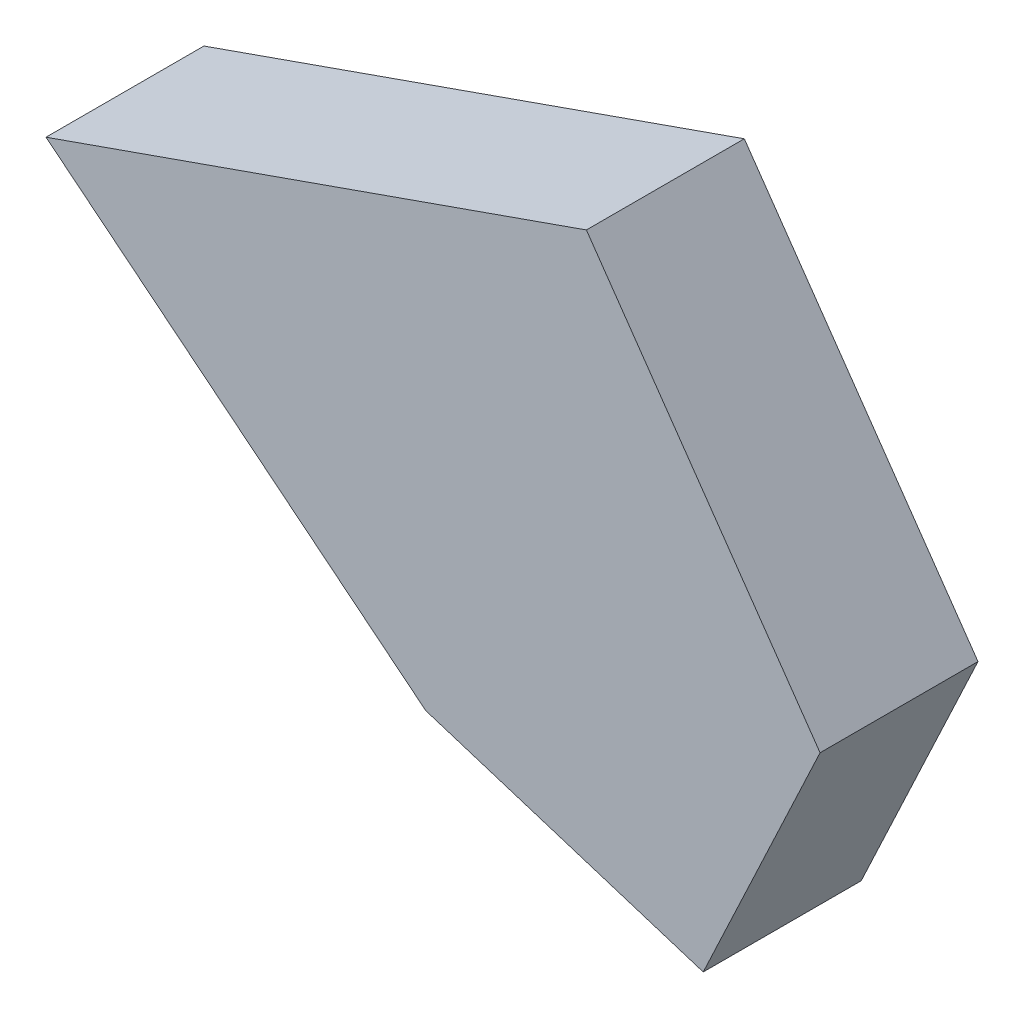
ISO-10303-21;
HEADER;
FILE_DESCRIPTION(('STEP AP214'),'2;1');
FILE_NAME('part.step','',(''),(''),'','','');
FILE_SCHEMA(('AUTOMOTIVE_DESIGN { 1 0 10303 214 1 1 1 1 }'));
ENDSEC;
DATA;
#1=APPLICATION_CONTEXT('core data for automotive mechanical design processes');
#2=APPLICATION_PROTOCOL_DEFINITION('international standard','automotive_design',2000,#1);
#3=PRODUCT_CONTEXT('',#1,'mechanical');
#4=PRODUCT('Part','Part','',(#3));
#5=PRODUCT_RELATED_PRODUCT_CATEGORY('part','',(#4));
#6=PRODUCT_DEFINITION_FORMATION('','',#4);
#7=PRODUCT_DEFINITION_CONTEXT('part definition',#1,'design');
#8=PRODUCT_DEFINITION('design','',#6,#7);
#9=PRODUCT_DEFINITION_SHAPE('','',#8);
#10=(LENGTH_UNIT() NAMED_UNIT(*) SI_UNIT(.MILLI.,.METRE.));
#11=(NAMED_UNIT(*) PLANE_ANGLE_UNIT() SI_UNIT($,.RADIAN.));
#12=(NAMED_UNIT(*) SI_UNIT($,.STERADIAN.) SOLID_ANGLE_UNIT());
#13=UNCERTAINTY_MEASURE_WITH_UNIT(LENGTH_MEASURE(1.E-05),#10,'distance_accuracy_value','');
#14=(GEOMETRIC_REPRESENTATION_CONTEXT(3) GLOBAL_UNCERTAINTY_ASSIGNED_CONTEXT((#13)) GLOBAL_UNIT_ASSIGNED_CONTEXT((#10,
#11,#12)) REPRESENTATION_CONTEXT('',''));
#15=CARTESIAN_POINT('',(0.,0.,0.));
#16=DIRECTION('',(0.,0.,1.));
#17=DIRECTION('',(1.,0.,0.));
#18=AXIS2_PLACEMENT_3D('',#15,#16,#17);
#19=CARTESIAN_POINT('',(0.,-3.,0.));
#20=DIRECTION('',(0.,0.,-1.));
#21=DIRECTION('',(1.,0.,0.));
#22=AXIS2_PLACEMENT_3D('',#19,#20,#21);
#23=PLANE('',#22);
#24=DIRECTION('',(0.777941180203722,-0.628337107087621,0.));
#25=VECTOR('',#24,1.);
#26=CARTESIAN_POINT('',(-26.,18.,0.));
#27=LINE('',#26,#25);
#28=CARTESIAN_POINT('',(-26.,18.,0.));
#29=VERTEX_POINT('',#28);
#30=CARTESIAN_POINT('',(0.,-3.,0.));
#31=VERTEX_POINT('',#30);
#32=EDGE_CURVE('E55',#29,#31,#27,.T.);
#33=ORIENTED_EDGE('',*,*,#32,.F.);
#34=DIRECTION('',(-0.943460139651132,-0.33148599501256,0.));
#35=VECTOR('',#34,1.);
#36=CARTESIAN_POINT('',(11.,31.,0.));
#37=LINE('',#36,#35);
#38=CARTESIAN_POINT('',(11.,31.,0.));
#39=VERTEX_POINT('',#38);
#40=EDGE_CURVE('E54',#39,#29,#37,.T.);
#41=ORIENTED_EDGE('',*,*,#40,.F.);
#42=DIRECTION('',(-0.5710644881986,0.820905201785487,0.));
#43=VECTOR('',#42,1.);
#44=CARTESIAN_POINT('',(27.,8.,0.));
#45=LINE('',#44,#43);
#46=CARTESIAN_POINT('',(27.,8.,0.));
#47=VERTEX_POINT('',#46);
#48=EDGE_CURVE('E53',#47,#39,#45,.T.);
#49=ORIENTED_EDGE('',*,*,#48,.F.);
#50=DIRECTION('',(0.42579703632988,0.904818702200994,0.));
#51=VECTOR('',#50,1.);
#52=CARTESIAN_POINT('',(19.,-9.,0.));
#53=LINE('',#52,#51);
#54=CARTESIAN_POINT('',(19.,-9.,0.));
#55=VERTEX_POINT('',#54);
#56=EDGE_CURVE('E52',#55,#47,#53,.T.);
#57=ORIENTED_EDGE('',*,*,#56,.F.);
#58=DIRECTION('',(0.953582665134142,-0.301131367937097,0.));
#59=VECTOR('',#58,1.);
#60=CARTESIAN_POINT('',(0.,-3.,0.));
#61=LINE('',#60,#59);
#62=EDGE_CURVE('E51',#31,#55,#61,.T.);
#63=ORIENTED_EDGE('',*,*,#62,.F.);
#64=EDGE_LOOP('',(#33,#41,#49,#57,#63));
#65=FACE_BOUND('',#64,.T.);
#66=ADVANCED_FACE('F7',(#65),#23,.T.);
#67=CARTESIAN_POINT('',(0.,-3.,10.813));
#68=DIRECTION('',(0.,0.,1.));
#69=DIRECTION('',(1.,0.,0.));
#70=AXIS2_PLACEMENT_3D('',#67,#68,#69);
#71=PLANE('',#70);
#72=DIRECTION('',(0.953582665134142,-0.301131367937097,0.));
#73=VECTOR('',#72,1.);
#74=CARTESIAN_POINT('',(0.,-3.,10.813));
#75=LINE('',#74,#73);
#76=CARTESIAN_POINT('',(0.,-3.,10.813));
#77=VERTEX_POINT('',#76);
#78=CARTESIAN_POINT('',(19.,-9.,10.813));
#79=VERTEX_POINT('',#78);
#80=EDGE_CURVE('E56',#77,#79,#75,.T.);
#81=ORIENTED_EDGE('',*,*,#80,.T.);
#82=DIRECTION('',(0.42579703632988,0.904818702200994,0.));
#83=VECTOR('',#82,1.);
#84=CARTESIAN_POINT('',(19.,-9.,10.813));
#85=LINE('',#84,#83);
#86=CARTESIAN_POINT('',(27.,8.,10.813));
#87=VERTEX_POINT('',#86);
#88=EDGE_CURVE('E57',#79,#87,#85,.T.);
#89=ORIENTED_EDGE('',*,*,#88,.T.);
#90=DIRECTION('',(-0.5710644881986,0.820905201785487,0.));
#91=VECTOR('',#90,1.);
#92=CARTESIAN_POINT('',(27.,8.,10.813));
#93=LINE('',#92,#91);
#94=CARTESIAN_POINT('',(11.,31.,10.813));
#95=VERTEX_POINT('',#94);
#96=EDGE_CURVE('E58',#87,#95,#93,.T.);
#97=ORIENTED_EDGE('',*,*,#96,.T.);
#98=DIRECTION('',(-0.943460139651132,-0.33148599501256,0.));
#99=VECTOR('',#98,1.);
#100=CARTESIAN_POINT('',(11.,31.,10.813));
#101=LINE('',#100,#99);
#102=CARTESIAN_POINT('',(-26.,18.,10.813));
#103=VERTEX_POINT('',#102);
#104=EDGE_CURVE('E59',#95,#103,#101,.T.);
#105=ORIENTED_EDGE('',*,*,#104,.T.);
#106=DIRECTION('',(0.777941180203722,-0.628337107087621,0.));
#107=VECTOR('',#106,1.);
#108=CARTESIAN_POINT('',(-26.,18.,10.813));
#109=LINE('',#108,#107);
#110=EDGE_CURVE('E60',#103,#77,#109,.T.);
#111=ORIENTED_EDGE('',*,*,#110,.T.);
#112=EDGE_LOOP('',(#81,#89,#97,#105,#111));
#113=FACE_BOUND('',#112,.T.);
#114=ADVANCED_FACE('F14',(#113),#71,.T.);
#115=CARTESIAN_POINT('',(0.,-3.,0.));
#116=DIRECTION('',(-0.301131367937097,-0.953582665134142,0.));
#117=DIRECTION('',(0.953582665134142,-0.301131367937097,0.));
#118=AXIS2_PLACEMENT_3D('',#115,#116,#117);
#119=PLANE('',#118);
#120=ORIENTED_EDGE('',*,*,#62,.T.);
#121=DIRECTION('',(0.,0.,1.));
#122=VECTOR('',#121,1.);
#123=CARTESIAN_POINT('',(19.,-9.,0.));
#124=LINE('',#123,#122);
#125=EDGE_CURVE('E62',#55,#79,#124,.T.);
#126=ORIENTED_EDGE('',*,*,#125,.T.);
#127=ORIENTED_EDGE('',*,*,#80,.F.);
#128=DIRECTION('',(0.,0.,1.));
#129=VECTOR('',#128,1.);
#130=CARTESIAN_POINT('',(0.,-3.,0.));
#131=LINE('',#130,#129);
#132=EDGE_CURVE('E61',#31,#77,#131,.T.);
#133=ORIENTED_EDGE('',*,*,#132,.F.);
#134=EDGE_LOOP('',(#120,#126,#127,#133));
#135=FACE_BOUND('',#134,.T.);
#136=ADVANCED_FACE('F21',(#135),#119,.T.);
#137=CARTESIAN_POINT('',(19.,-9.,0.));
#138=DIRECTION('',(0.904818702200994,-0.42579703632988,0.));
#139=DIRECTION('',(0.42579703632988,0.904818702200994,0.));
#140=AXIS2_PLACEMENT_3D('',#137,#138,#139);
#141=PLANE('',#140);
#142=ORIENTED_EDGE('',*,*,#56,.T.);
#143=DIRECTION('',(0.,0.,1.));
#144=VECTOR('',#143,1.);
#145=CARTESIAN_POINT('',(27.,8.,0.));
#146=LINE('',#145,#144);
#147=EDGE_CURVE('E63',#47,#87,#146,.T.);
#148=ORIENTED_EDGE('',*,*,#147,.T.);
#149=ORIENTED_EDGE('',*,*,#88,.F.);
#150=ORIENTED_EDGE('',*,*,#125,.F.);
#151=EDGE_LOOP('',(#142,#148,#149,#150));
#152=FACE_BOUND('',#151,.T.);
#153=ADVANCED_FACE('F27',(#152),#141,.T.);
#154=CARTESIAN_POINT('',(27.,8.,0.));
#155=DIRECTION('',(0.820905201785487,0.5710644881986,0.));
#156=DIRECTION('',(-0.5710644881986,0.820905201785487,0.));
#157=AXIS2_PLACEMENT_3D('',#154,#155,#156);
#158=PLANE('',#157);
#159=ORIENTED_EDGE('',*,*,#48,.T.);
#160=DIRECTION('',(0.,0.,1.));
#161=VECTOR('',#160,1.);
#162=CARTESIAN_POINT('',(11.,31.,0.));
#163=LINE('',#162,#161);
#164=EDGE_CURVE('E64',#39,#95,#163,.T.);
#165=ORIENTED_EDGE('',*,*,#164,.T.);
#166=ORIENTED_EDGE('',*,*,#96,.F.);
#167=ORIENTED_EDGE('',*,*,#147,.F.);
#168=EDGE_LOOP('',(#159,#165,#166,#167));
#169=FACE_BOUND('',#168,.T.);
#170=ADVANCED_FACE('F33',(#169),#158,.T.);
#171=CARTESIAN_POINT('',(11.,31.,0.));
#172=DIRECTION('',(-0.33148599501256,0.943460139651132,0.));
#173=DIRECTION('',(-0.943460139651132,-0.33148599501256,0.));
#174=AXIS2_PLACEMENT_3D('',#171,#172,#173);
#175=PLANE('',#174);
#176=ORIENTED_EDGE('',*,*,#40,.T.);
#177=DIRECTION('',(0.,0.,1.));
#178=VECTOR('',#177,1.);
#179=CARTESIAN_POINT('',(-26.,18.,0.));
#180=LINE('',#179,#178);
#181=EDGE_CURVE('E65',#29,#103,#180,.T.);
#182=ORIENTED_EDGE('',*,*,#181,.T.);
#183=ORIENTED_EDGE('',*,*,#104,.F.);
#184=ORIENTED_EDGE('',*,*,#164,.F.);
#185=EDGE_LOOP('',(#176,#182,#183,#184));
#186=FACE_BOUND('',#185,.T.);
#187=ADVANCED_FACE('F39',(#186),#175,.T.);
#188=CARTESIAN_POINT('',(-26.,18.,0.));
#189=DIRECTION('',(-0.628337107087621,-0.777941180203722,0.));
#190=DIRECTION('',(0.777941180203722,-0.628337107087621,0.));
#191=AXIS2_PLACEMENT_3D('',#188,#189,#190);
#192=PLANE('',#191);
#193=ORIENTED_EDGE('',*,*,#32,.T.);
#194=ORIENTED_EDGE('',*,*,#132,.T.);
#195=ORIENTED_EDGE('',*,*,#110,.F.);
#196=ORIENTED_EDGE('',*,*,#181,.F.);
#197=EDGE_LOOP('',(#193,#194,#195,#196));
#198=FACE_BOUND('',#197,.T.);
#199=ADVANCED_FACE('F45',(#198),#192,.T.);
#200=CLOSED_SHELL('',(#66,#114,#136,#153,#170,#187,#199));
#201=MANIFOLD_SOLID_BREP('B2',#200);
#202=ADVANCED_BREP_SHAPE_REPRESENTATION('',(#18,#201),#14);
#203=SHAPE_DEFINITION_REPRESENTATION(#9,#202);
ENDSEC;
END-ISO-10303-21;
